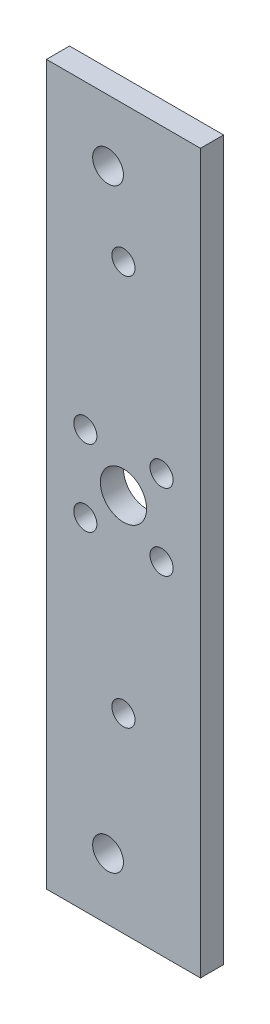
ISO-10303-21;
HEADER;
FILE_DESCRIPTION(('STEP AP214'),'2;1');
FILE_NAME('part.step','',(''),(''),'','','');
FILE_SCHEMA(('AUTOMOTIVE_DESIGN { 1 0 10303 214 1 1 1 1 }'));
ENDSEC;
DATA;
#1=APPLICATION_CONTEXT('core data for automotive mechanical design processes');
#2=APPLICATION_PROTOCOL_DEFINITION('international standard','automotive_design',2000,#1);
#3=PRODUCT_CONTEXT('',#1,'mechanical');
#4=PRODUCT('Part','Part','',(#3));
#5=PRODUCT_RELATED_PRODUCT_CATEGORY('part','',(#4));
#6=PRODUCT_DEFINITION_FORMATION('','',#4);
#7=PRODUCT_DEFINITION_CONTEXT('part definition',#1,'design');
#8=PRODUCT_DEFINITION('design','',#6,#7);
#9=PRODUCT_DEFINITION_SHAPE('','',#8);
#10=(LENGTH_UNIT() NAMED_UNIT(*) SI_UNIT(.MILLI.,.METRE.));
#11=(NAMED_UNIT(*) PLANE_ANGLE_UNIT() SI_UNIT($,.RADIAN.));
#12=(NAMED_UNIT(*) SI_UNIT($,.STERADIAN.) SOLID_ANGLE_UNIT());
#13=UNCERTAINTY_MEASURE_WITH_UNIT(LENGTH_MEASURE(1.E-05),#10,'distance_accuracy_value','');
#14=(GEOMETRIC_REPRESENTATION_CONTEXT(3) GLOBAL_UNCERTAINTY_ASSIGNED_CONTEXT((#13)) GLOBAL_UNIT_ASSIGNED_CONTEXT((#10,
#11,#12)) REPRESENTATION_CONTEXT('',''));
#15=CARTESIAN_POINT('',(0.,0.,0.));
#16=DIRECTION('',(0.,0.,1.));
#17=DIRECTION('',(1.,0.,0.));
#18=AXIS2_PLACEMENT_3D('',#15,#16,#17);
#19=CARTESIAN_POINT('',(0.,0.,3.));
#20=DIRECTION('',(0.,0.,1.));
#21=DIRECTION('',(1.,0.,0.));
#22=AXIS2_PLACEMENT_3D('',#19,#20,#21);
#23=PLANE('',#22);
#24=CARTESIAN_POINT('',(-14.0043024982098,49.7604113634047,3.));
#25=DIRECTION('',(0.,0.,1.));
#26=DIRECTION('',(1.,0.,0.));
#27=AXIS2_PLACEMENT_3D('',#24,#25,#26);
#28=CIRCLE('',#27,2.);
#29=CARTESIAN_POINT('',(-12.0043024982098,49.7604113634047,3.));
#30=VERTEX_POINT('',#29);
#31=EDGE_CURVE('E217',#30,#30,#28,.T.);
#32=ORIENTED_EDGE('',*,*,#31,.F.);
#33=EDGE_LOOP('',(#32));
#34=FACE_BOUND('',#33,.T.);
#35=CARTESIAN_POINT('',(-14.0043024982098,-27.5388819792906,3.));
#36=DIRECTION('',(0.,0.,1.));
#37=DIRECTION('',(1.,0.,0.));
#38=AXIS2_PLACEMENT_3D('',#35,#36,#37);
#39=CIRCLE('',#38,2.);
#40=CARTESIAN_POINT('',(-12.0043024982098,-27.5388819792906,3.));
#41=VERTEX_POINT('',#40);
#42=EDGE_CURVE('E137',#41,#41,#39,.T.);
#43=ORIENTED_EDGE('',*,*,#42,.F.);
#44=EDGE_LOOP('',(#43));
#45=FACE_BOUND('',#44,.T.);
#46=CARTESIAN_POINT('',(-12.0043024982099,40.0074368658503,3.));
#47=DIRECTION('',(0.,0.,-1.));
#48=DIRECTION('',(-1.,0.,0.));
#49=AXIS2_PLACEMENT_3D('',#46,#47,#48);
#50=CIRCLE('',#49,1.5);
#51=CARTESIAN_POINT('',(-13.5043024982099,40.0074368658503,3.));
#52=VERTEX_POINT('',#51);
#53=EDGE_CURVE('E157',#52,#52,#50,.T.);
#54=ORIENTED_EDGE('',*,*,#53,.T.);
#55=EDGE_LOOP('',(#54));
#56=FACE_BOUND('',#55,.T.);
#57=CARTESIAN_POINT('',(-12.0043024982099,-10.785171843697,3.));
#58=DIRECTION('',(0.,0.,-1.));
#59=DIRECTION('',(-1.,0.,0.));
#60=AXIS2_PLACEMENT_3D('',#57,#58,#59);
#61=CIRCLE('',#60,1.5);
#62=CARTESIAN_POINT('',(-13.5043024982099,-10.785171843697,3.));
#63=VERTEX_POINT('',#62);
#64=EDGE_CURVE('E156',#63,#63,#61,.T.);
#65=ORIENTED_EDGE('',*,*,#64,.T.);
#66=EDGE_LOOP('',(#65));
#67=FACE_BOUND('',#66,.T.);
#68=CARTESIAN_POINT('',(-12.0043024982099,13.7111325110767,3.));
#69=DIRECTION('',(0.,0.,-1.));
#70=DIRECTION('',(-1.,0.,0.));
#71=AXIS2_PLACEMENT_3D('',#68,#69,#70);
#72=CIRCLE('',#71,3.);
#73=CARTESIAN_POINT('',(-15.0043024982099,13.7111325110767,3.));
#74=VERTEX_POINT('',#73);
#75=EDGE_CURVE('E161',#74,#74,#72,.T.);
#76=ORIENTED_EDGE('',*,*,#75,.T.);
#77=EDGE_LOOP('',(#76));
#78=FACE_BOUND('',#77,.T.);
#79=CARTESIAN_POINT('',(-7.05455502990386,8.76138504277067,3.));
#80=DIRECTION('',(0.,0.,-1.));
#81=DIRECTION('',(-1.,0.,0.));
#82=AXIS2_PLACEMENT_3D('',#79,#80,#81);
#83=CIRCLE('',#82,1.5);
#84=CARTESIAN_POINT('',(-8.55455502990386,8.76138504277067,3.));
#85=VERTEX_POINT('',#84);
#86=EDGE_CURVE('E194',#85,#85,#83,.T.);
#87=ORIENTED_EDGE('',*,*,#86,.T.);
#88=EDGE_LOOP('',(#87));
#89=FACE_BOUND('',#88,.T.);
#90=CARTESIAN_POINT('',(-16.9540499665159,8.76138504277067,3.));
#91=DIRECTION('',(0.,0.,-1.));
#92=DIRECTION('',(-1.,0.,0.));
#93=AXIS2_PLACEMENT_3D('',#90,#91,#92);
#94=CIRCLE('',#93,1.5);
#95=CARTESIAN_POINT('',(-18.4540499665159,8.76138504277067,3.));
#96=VERTEX_POINT('',#95);
#97=EDGE_CURVE('E186',#96,#96,#94,.T.);
#98=ORIENTED_EDGE('',*,*,#97,.T.);
#99=EDGE_LOOP('',(#98));
#100=FACE_BOUND('',#99,.T.);
#101=CARTESIAN_POINT('',(-16.9540499665159,18.6608799793827,3.));
#102=DIRECTION('',(0.,0.,-1.));
#103=DIRECTION('',(-1.,0.,0.));
#104=AXIS2_PLACEMENT_3D('',#101,#102,#103);
#105=CIRCLE('',#104,1.5);
#106=CARTESIAN_POINT('',(-18.4540499665159,18.6608799793827,3.));
#107=VERTEX_POINT('',#106);
#108=EDGE_CURVE('E178',#107,#107,#105,.T.);
#109=ORIENTED_EDGE('',*,*,#108,.T.);
#110=EDGE_LOOP('',(#109));
#111=FACE_BOUND('',#110,.T.);
#112=CARTESIAN_POINT('',(-7.05455502990385,18.6608799793827,3.));
#113=DIRECTION('',(0.,0.,-1.));
#114=DIRECTION('',(-1.,0.,0.));
#115=AXIS2_PLACEMENT_3D('',#112,#113,#114);
#116=CIRCLE('',#115,1.5);
#117=CARTESIAN_POINT('',(-8.55455502990386,18.6608799793827,3.));
#118=VERTEX_POINT('',#117);
#119=EDGE_CURVE('E205',#118,#118,#116,.T.);
#120=ORIENTED_EDGE('',*,*,#119,.T.);
#121=EDGE_LOOP('',(#120));
#122=FACE_BOUND('',#121,.T.);
#123=DIRECTION('',(0.,1.,0.));
#124=VECTOR('',#123,1.);
#125=CARTESIAN_POINT('',(-22.0043024982099,-30.5388819792904,3.));
#126=LINE('',#125,#124);
#127=CARTESIAN_POINT('',(-22.0043024982099,-35.5388819792904,3.));
#128=VERTEX_POINT('',#127);
#129=CARTESIAN_POINT('',(-22.0043024982099,57.7604113634049,3.));
#130=VERTEX_POINT('',#129);
#131=EDGE_CURVE('E94',#128,#130,#126,.T.);
#132=ORIENTED_EDGE('',*,*,#131,.F.);
#133=DIRECTION('',(-1.,0.,0.));
#134=VECTOR('',#133,1.);
#135=CARTESIAN_POINT('',(-2.00430249820982,-35.5388819792904,3.));
#136=LINE('',#135,#134);
#137=CARTESIAN_POINT('',(-2.00430249820982,-35.5388819792904,3.));
#138=VERTEX_POINT('',#137);
#139=EDGE_CURVE('E121',#138,#128,#136,.T.);
#140=ORIENTED_EDGE('',*,*,#139,.F.);
#141=DIRECTION('',(0.,1.,0.));
#142=VECTOR('',#141,1.);
#143=CARTESIAN_POINT('',(-2.00430249820982,-30.5388819792904,3.));
#144=LINE('',#143,#142);
#145=CARTESIAN_POINT('',(-2.00430249820981,57.7604113634049,3.));
#146=VERTEX_POINT('',#145);
#147=EDGE_CURVE('E86',#138,#146,#144,.T.);
#148=ORIENTED_EDGE('',*,*,#147,.T.);
#149=DIRECTION('',(1.,0.,0.));
#150=VECTOR('',#149,1.);
#151=CARTESIAN_POINT('',(-22.0043024982099,57.7604113634049,3.));
#152=LINE('',#151,#150);
#153=EDGE_CURVE('E153',#130,#146,#152,.T.);
#154=ORIENTED_EDGE('',*,*,#153,.F.);
#155=EDGE_LOOP('',(#132,#140,#148,#154));
#156=FACE_BOUND('',#155,.T.);
#157=ADVANCED_FACE('F68',(#34,#45,#56,#67,#78,#89,#100,#111,#122,#156),#23,.T.);
#158=CARTESIAN_POINT('',(0.,0.,0.));
#159=DIRECTION('',(0.,0.,1.));
#160=DIRECTION('',(1.,0.,0.));
#161=AXIS2_PLACEMENT_3D('',#158,#159,#160);
#162=PLANE('',#161);
#163=CARTESIAN_POINT('',(-14.0043024982098,49.7604113634047,0.));
#164=DIRECTION('',(0.,0.,1.));
#165=DIRECTION('',(1.,0.,0.));
#166=AXIS2_PLACEMENT_3D('',#163,#164,#165);
#167=CIRCLE('',#166,2.);
#168=CARTESIAN_POINT('',(-12.0043024982098,49.7604113634047,0.));
#169=VERTEX_POINT('',#168);
#170=EDGE_CURVE('E72',#169,#169,#167,.T.);
#171=ORIENTED_EDGE('',*,*,#170,.T.);
#172=EDGE_LOOP('',(#171));
#173=FACE_BOUND('',#172,.T.);
#174=CARTESIAN_POINT('',(-14.0043024982098,-27.5388819792906,0.));
#175=DIRECTION('',(0.,0.,1.));
#176=DIRECTION('',(1.,0.,0.));
#177=AXIS2_PLACEMENT_3D('',#174,#175,#176);
#178=CIRCLE('',#177,2.);
#179=CARTESIAN_POINT('',(-12.0043024982098,-27.5388819792906,0.));
#180=VERTEX_POINT('',#179);
#181=EDGE_CURVE('E135',#180,#180,#178,.T.);
#182=ORIENTED_EDGE('',*,*,#181,.T.);
#183=EDGE_LOOP('',(#182));
#184=FACE_BOUND('',#183,.T.);
#185=CARTESIAN_POINT('',(-12.0043024982099,40.0074368658503,0.));
#186=DIRECTION('',(0.,0.,-1.));
#187=DIRECTION('',(-1.,0.,0.));
#188=AXIS2_PLACEMENT_3D('',#185,#186,#187);
#189=CIRCLE('',#188,1.5);
#190=CARTESIAN_POINT('',(-13.5043024982099,40.0074368658503,0.));
#191=VERTEX_POINT('',#190);
#192=EDGE_CURVE('E162',#191,#191,#189,.T.);
#193=ORIENTED_EDGE('',*,*,#192,.F.);
#194=EDGE_LOOP('',(#193));
#195=FACE_BOUND('',#194,.T.);
#196=CARTESIAN_POINT('',(-12.0043024982099,-10.785171843697,0.));
#197=DIRECTION('',(0.,0.,-1.));
#198=DIRECTION('',(-1.,0.,0.));
#199=AXIS2_PLACEMENT_3D('',#196,#197,#198);
#200=CIRCLE('',#199,1.5);
#201=CARTESIAN_POINT('',(-13.5043024982099,-10.785171843697,0.));
#202=VERTEX_POINT('',#201);
#203=EDGE_CURVE('E166',#202,#202,#200,.T.);
#204=ORIENTED_EDGE('',*,*,#203,.F.);
#205=EDGE_LOOP('',(#204));
#206=FACE_BOUND('',#205,.T.);
#207=CARTESIAN_POINT('',(-12.0043024982099,13.7111325110767,0.));
#208=DIRECTION('',(0.,0.,-1.));
#209=DIRECTION('',(-1.,0.,0.));
#210=AXIS2_PLACEMENT_3D('',#207,#208,#209);
#211=CIRCLE('',#210,3.);
#212=CARTESIAN_POINT('',(-15.0043024982099,13.7111325110767,0.));
#213=VERTEX_POINT('',#212);
#214=EDGE_CURVE('E198',#213,#213,#211,.T.);
#215=ORIENTED_EDGE('',*,*,#214,.F.);
#216=EDGE_LOOP('',(#215));
#217=FACE_BOUND('',#216,.T.);
#218=CARTESIAN_POINT('',(-7.05455502990386,8.76138504277067,0.));
#219=DIRECTION('',(0.,0.,-1.));
#220=DIRECTION('',(-1.,0.,0.));
#221=AXIS2_PLACEMENT_3D('',#218,#219,#220);
#222=CIRCLE('',#221,1.5);
#223=CARTESIAN_POINT('',(-8.55455502990386,8.76138504277067,0.));
#224=VERTEX_POINT('',#223);
#225=EDGE_CURVE('E190',#224,#224,#222,.T.);
#226=ORIENTED_EDGE('',*,*,#225,.F.);
#227=EDGE_LOOP('',(#226));
#228=FACE_BOUND('',#227,.T.);
#229=CARTESIAN_POINT('',(-16.9540499665159,8.76138504277067,0.));
#230=DIRECTION('',(0.,0.,-1.));
#231=DIRECTION('',(-1.,0.,0.));
#232=AXIS2_PLACEMENT_3D('',#229,#230,#231);
#233=CIRCLE('',#232,1.5);
#234=CARTESIAN_POINT('',(-18.4540499665159,8.76138504277067,0.));
#235=VERTEX_POINT('',#234);
#236=EDGE_CURVE('E182',#235,#235,#233,.T.);
#237=ORIENTED_EDGE('',*,*,#236,.F.);
#238=EDGE_LOOP('',(#237));
#239=FACE_BOUND('',#238,.T.);
#240=CARTESIAN_POINT('',(-16.9540499665159,18.6608799793827,0.));
#241=DIRECTION('',(0.,0.,-1.));
#242=DIRECTION('',(-1.,0.,0.));
#243=AXIS2_PLACEMENT_3D('',#240,#241,#242);
#244=CIRCLE('',#243,1.5);
#245=CARTESIAN_POINT('',(-18.4540499665159,18.6608799793827,0.));
#246=VERTEX_POINT('',#245);
#247=EDGE_CURVE('E173',#246,#246,#244,.T.);
#248=ORIENTED_EDGE('',*,*,#247,.F.);
#249=EDGE_LOOP('',(#248));
#250=FACE_BOUND('',#249,.T.);
#251=CARTESIAN_POINT('',(-7.05455502990385,18.6608799793827,0.));
#252=DIRECTION('',(0.,0.,-1.));
#253=DIRECTION('',(-1.,0.,0.));
#254=AXIS2_PLACEMENT_3D('',#251,#252,#253);
#255=CIRCLE('',#254,1.5);
#256=CARTESIAN_POINT('',(-8.55455502990386,18.6608799793827,0.));
#257=VERTEX_POINT('',#256);
#258=EDGE_CURVE('E177',#257,#257,#255,.T.);
#259=ORIENTED_EDGE('',*,*,#258,.F.);
#260=EDGE_LOOP('',(#259));
#261=FACE_BOUND('',#260,.T.);
#262=DIRECTION('',(0.,1.,0.));
#263=VECTOR('',#262,1.);
#264=CARTESIAN_POINT('',(-2.00430249820982,-30.5388819792904,0.));
#265=LINE('',#264,#263);
#266=CARTESIAN_POINT('',(-2.00430249820982,-35.5388819792904,0.));
#267=VERTEX_POINT('',#266);
#268=CARTESIAN_POINT('',(-2.00430249820981,57.7604113634049,0.));
#269=VERTEX_POINT('',#268);
#270=EDGE_CURVE('E13',#267,#269,#265,.T.);
#271=ORIENTED_EDGE('',*,*,#270,.F.);
#272=DIRECTION('',(1.,0.,0.));
#273=VECTOR('',#272,1.);
#274=CARTESIAN_POINT('',(-22.0043024982099,-35.5388819792904,0.));
#275=LINE('',#274,#273);
#276=CARTESIAN_POINT('',(-22.0043024982099,-35.5388819792904,0.));
#277=VERTEX_POINT('',#276);
#278=EDGE_CURVE('E130',#277,#267,#275,.T.);
#279=ORIENTED_EDGE('',*,*,#278,.F.);
#280=DIRECTION('',(0.,1.,0.));
#281=VECTOR('',#280,1.);
#282=CARTESIAN_POINT('',(-22.0043024982099,-30.5388819792904,0.));
#283=LINE('',#282,#281);
#284=CARTESIAN_POINT('',(-22.0043024982099,57.7604113634049,0.));
#285=VERTEX_POINT('',#284);
#286=EDGE_CURVE('E78',#277,#285,#283,.T.);
#287=ORIENTED_EDGE('',*,*,#286,.T.);
#288=DIRECTION('',(-1.,0.,0.));
#289=VECTOR('',#288,1.);
#290=CARTESIAN_POINT('',(-2.00430249820981,57.7604113634049,0.));
#291=LINE('',#290,#289);
#292=EDGE_CURVE('E146',#269,#285,#291,.T.);
#293=ORIENTED_EDGE('',*,*,#292,.F.);
#294=EDGE_LOOP('',(#271,#279,#287,#293));
#295=FACE_BOUND('',#294,.T.);
#296=ADVANCED_FACE('F70',(#173,#184,#195,#206,#217,#228,#239,#250,#261,#295),#162,.F.);
#297=CARTESIAN_POINT('',(-22.0043024982099,-30.5388819792904,0.));
#298=DIRECTION('',(1.,0.,0.));
#299=DIRECTION('',(0.,1.,0.));
#300=AXIS2_PLACEMENT_3D('',#297,#298,#299);
#301=PLANE('',#300);
#302=ORIENTED_EDGE('',*,*,#286,.F.);
#303=DIRECTION('',(0.,0.,-1.));
#304=VECTOR('',#303,1.);
#305=CARTESIAN_POINT('',(-22.0043024982099,-35.5388819792904,3.));
#306=LINE('',#305,#304);
#307=EDGE_CURVE('E125',#128,#277,#306,.T.);
#308=ORIENTED_EDGE('',*,*,#307,.F.);
#309=ORIENTED_EDGE('',*,*,#131,.T.);
#310=DIRECTION('',(0.,0.,1.));
#311=VECTOR('',#310,1.);
#312=CARTESIAN_POINT('',(-22.0043024982099,57.7604113634049,0.));
#313=LINE('',#312,#311);
#314=EDGE_CURVE('E150',#285,#130,#313,.T.);
#315=ORIENTED_EDGE('',*,*,#314,.F.);
#316=EDGE_LOOP('',(#302,#308,#309,#315));
#317=FACE_BOUND('',#316,.T.);
#318=ADVANCED_FACE('F257',(#317),#301,.F.);
#319=CARTESIAN_POINT('',(-2.00430249820982,-30.5388819792904,0.));
#320=DIRECTION('',(1.,0.,0.));
#321=DIRECTION('',(0.,1.,0.));
#322=AXIS2_PLACEMENT_3D('',#319,#320,#321);
#323=PLANE('',#322);
#324=ORIENTED_EDGE('',*,*,#270,.T.);
#325=DIRECTION('',(0.,0.,-1.));
#326=VECTOR('',#325,1.);
#327=CARTESIAN_POINT('',(-2.00430249820981,57.7604113634049,3.));
#328=LINE('',#327,#326);
#329=EDGE_CURVE('E117',#146,#269,#328,.T.);
#330=ORIENTED_EDGE('',*,*,#329,.F.);
#331=ORIENTED_EDGE('',*,*,#147,.F.);
#332=DIRECTION('',(0.,0.,1.));
#333=VECTOR('',#332,1.);
#334=CARTESIAN_POINT('',(-2.00430249820982,-35.5388819792904,0.));
#335=LINE('',#334,#333);
#336=EDGE_CURVE('E115',#267,#138,#335,.T.);
#337=ORIENTED_EDGE('',*,*,#336,.F.);
#338=EDGE_LOOP('',(#324,#330,#331,#337));
#339=FACE_BOUND('',#338,.T.);
#340=ADVANCED_FACE('F113',(#339),#323,.T.);
#341=CARTESIAN_POINT('',(-7.05455502990385,18.6608799793827,3.));
#342=DIRECTION('',(0.,0.,-1.));
#343=DIRECTION('',(-1.,0.,0.));
#344=AXIS2_PLACEMENT_3D('',#341,#342,#343);
#345=CYLINDRICAL_SURFACE('',#344,1.5);
#346=ORIENTED_EDGE('',*,*,#119,.F.);
#347=EDGE_LOOP('',(#346));
#348=FACE_BOUND('',#347,.T.);
#349=ORIENTED_EDGE('',*,*,#258,.T.);
#350=EDGE_LOOP('',(#349));
#351=FACE_BOUND('',#350,.T.);
#352=ADVANCED_FACE('F248',(#348,#351),#345,.F.);
#353=CARTESIAN_POINT('',(-16.9540499665159,18.6608799793827,3.));
#354=DIRECTION('',(0.,0.,-1.));
#355=DIRECTION('',(-1.,0.,0.));
#356=AXIS2_PLACEMENT_3D('',#353,#354,#355);
#357=CYLINDRICAL_SURFACE('',#356,1.5);
#358=ORIENTED_EDGE('',*,*,#108,.F.);
#359=EDGE_LOOP('',(#358));
#360=FACE_BOUND('',#359,.T.);
#361=ORIENTED_EDGE('',*,*,#247,.T.);
#362=EDGE_LOOP('',(#361));
#363=FACE_BOUND('',#362,.T.);
#364=ADVANCED_FACE('F251',(#360,#363),#357,.F.);
#365=CARTESIAN_POINT('',(-16.9540499665159,8.76138504277067,3.));
#366=DIRECTION('',(0.,0.,-1.));
#367=DIRECTION('',(-1.,0.,0.));
#368=AXIS2_PLACEMENT_3D('',#365,#366,#367);
#369=CYLINDRICAL_SURFACE('',#368,1.5);
#370=ORIENTED_EDGE('',*,*,#97,.F.);
#371=EDGE_LOOP('',(#370));
#372=FACE_BOUND('',#371,.T.);
#373=ORIENTED_EDGE('',*,*,#236,.T.);
#374=EDGE_LOOP('',(#373));
#375=FACE_BOUND('',#374,.T.);
#376=ADVANCED_FACE('F277',(#372,#375),#369,.F.);
#377=CARTESIAN_POINT('',(-7.05455502990386,8.76138504277067,3.));
#378=DIRECTION('',(0.,0.,-1.));
#379=DIRECTION('',(-1.,0.,0.));
#380=AXIS2_PLACEMENT_3D('',#377,#378,#379);
#381=CYLINDRICAL_SURFACE('',#380,1.5);
#382=ORIENTED_EDGE('',*,*,#86,.F.);
#383=EDGE_LOOP('',(#382));
#384=FACE_BOUND('',#383,.T.);
#385=ORIENTED_EDGE('',*,*,#225,.T.);
#386=EDGE_LOOP('',(#385));
#387=FACE_BOUND('',#386,.T.);
#388=ADVANCED_FACE('F273',(#384,#387),#381,.F.);
#389=CARTESIAN_POINT('',(-12.0043024982099,13.7111325110767,3.));
#390=DIRECTION('',(0.,0.,-1.));
#391=DIRECTION('',(-1.,0.,0.));
#392=AXIS2_PLACEMENT_3D('',#389,#390,#391);
#393=CYLINDRICAL_SURFACE('',#392,3.);
#394=ORIENTED_EDGE('',*,*,#75,.F.);
#395=EDGE_LOOP('',(#394));
#396=FACE_BOUND('',#395,.T.);
#397=ORIENTED_EDGE('',*,*,#214,.T.);
#398=EDGE_LOOP('',(#397));
#399=FACE_BOUND('',#398,.T.);
#400=ADVANCED_FACE('F269',(#396,#399),#393,.F.);
#401=CARTESIAN_POINT('',(-12.0043024982099,-10.785171843697,3.));
#402=DIRECTION('',(0.,0.,-1.));
#403=DIRECTION('',(-1.,0.,0.));
#404=AXIS2_PLACEMENT_3D('',#401,#402,#403);
#405=CYLINDRICAL_SURFACE('',#404,1.5);
#406=ORIENTED_EDGE('',*,*,#64,.F.);
#407=EDGE_LOOP('',(#406));
#408=FACE_BOUND('',#407,.T.);
#409=ORIENTED_EDGE('',*,*,#203,.T.);
#410=EDGE_LOOP('',(#409));
#411=FACE_BOUND('',#410,.T.);
#412=ADVANCED_FACE('F272',(#408,#411),#405,.F.);
#413=CARTESIAN_POINT('',(-12.0043024982099,40.0074368658503,3.));
#414=DIRECTION('',(0.,0.,-1.));
#415=DIRECTION('',(-1.,0.,0.));
#416=AXIS2_PLACEMENT_3D('',#413,#414,#415);
#417=CYLINDRICAL_SURFACE('',#416,1.5);
#418=ORIENTED_EDGE('',*,*,#53,.F.);
#419=EDGE_LOOP('',(#418));
#420=FACE_BOUND('',#419,.T.);
#421=ORIENTED_EDGE('',*,*,#192,.T.);
#422=EDGE_LOOP('',(#421));
#423=FACE_BOUND('',#422,.T.);
#424=ADVANCED_FACE('F287',(#420,#423),#417,.F.);
#425=CARTESIAN_POINT('',(0.,57.7604113634049,0.));
#426=DIRECTION('',(0.,1.,0.));
#427=DIRECTION('',(0.,0.,1.));
#428=AXIS2_PLACEMENT_3D('',#425,#426,#427);
#429=PLANE('',#428);
#430=ORIENTED_EDGE('',*,*,#329,.T.);
#431=ORIENTED_EDGE('',*,*,#292,.T.);
#432=ORIENTED_EDGE('',*,*,#314,.T.);
#433=ORIENTED_EDGE('',*,*,#153,.T.);
#434=EDGE_LOOP('',(#430,#431,#432,#433));
#435=FACE_BOUND('',#434,.T.);
#436=ADVANCED_FACE('F261',(#435),#429,.T.);
#437=CARTESIAN_POINT('',(0.,-35.5388819792904,0.));
#438=DIRECTION('',(0.,-1.,0.));
#439=DIRECTION('',(0.,0.,-1.));
#440=AXIS2_PLACEMENT_3D('',#437,#438,#439);
#441=PLANE('',#440);
#442=ORIENTED_EDGE('',*,*,#336,.T.);
#443=ORIENTED_EDGE('',*,*,#139,.T.);
#444=ORIENTED_EDGE('',*,*,#307,.T.);
#445=ORIENTED_EDGE('',*,*,#278,.T.);
#446=EDGE_LOOP('',(#442,#443,#444,#445));
#447=FACE_BOUND('',#446,.T.);
#448=ADVANCED_FACE('F128',(#447),#441,.T.);
#449=CARTESIAN_POINT('',(-14.0043024982098,-27.5388819792906,-2.));
#450=DIRECTION('',(0.,0.,1.));
#451=DIRECTION('',(1.,0.,0.));
#452=AXIS2_PLACEMENT_3D('',#449,#450,#451);
#453=CYLINDRICAL_SURFACE('',#452,2.);
#454=ORIENTED_EDGE('',*,*,#42,.T.);
#455=EDGE_LOOP('',(#454));
#456=FACE_BOUND('',#455,.T.);
#457=ORIENTED_EDGE('',*,*,#181,.F.);
#458=EDGE_LOOP('',(#457));
#459=FACE_BOUND('',#458,.T.);
#460=ADVANCED_FACE('F228',(#456,#459),#453,.F.);
#461=CARTESIAN_POINT('',(-14.0043024982098,49.7604113634047,-2.));
#462=DIRECTION('',(0.,0.,1.));
#463=DIRECTION('',(1.,0.,0.));
#464=AXIS2_PLACEMENT_3D('',#461,#462,#463);
#465=CYLINDRICAL_SURFACE('',#464,2.);
#466=ORIENTED_EDGE('',*,*,#31,.T.);
#467=EDGE_LOOP('',(#466));
#468=FACE_BOUND('',#467,.T.);
#469=ORIENTED_EDGE('',*,*,#170,.F.);
#470=EDGE_LOOP('',(#469));
#471=FACE_BOUND('',#470,.T.);
#472=ADVANCED_FACE('F298',(#468,#471),#465,.F.);
#473=CLOSED_SHELL('',(#157,#296,#318,#340,#352,#364,#376,#388,#400,#412,#424,#436,#448,#460,#472));
#474=MANIFOLD_SOLID_BREP('B2',#473);
#475=ADVANCED_BREP_SHAPE_REPRESENTATION('',(#18,#474),#14);
#476=SHAPE_DEFINITION_REPRESENTATION(#9,#475);
ENDSEC;
END-ISO-10303-21;
